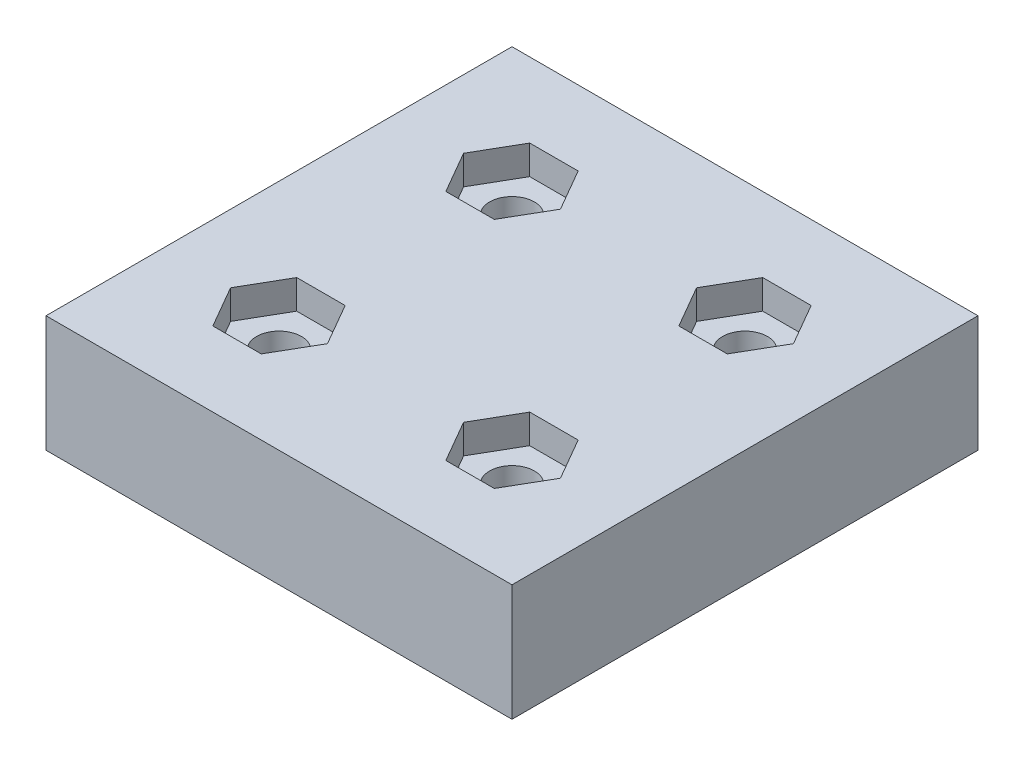
ISO-10303-21;
HEADER;
FILE_DESCRIPTION(('STEP AP214'),'2;1');
FILE_NAME('part.step','',(''),(''),'','','');
FILE_SCHEMA(('AUTOMOTIVE_DESIGN { 1 0 10303 214 1 1 1 1 }'));
ENDSEC;
DATA;
#1=APPLICATION_CONTEXT('core data for automotive mechanical design processes');
#2=APPLICATION_PROTOCOL_DEFINITION('international standard','automotive_design',2000,#1);
#3=PRODUCT_CONTEXT('',#1,'mechanical');
#4=PRODUCT('Part','Part','',(#3));
#5=PRODUCT_RELATED_PRODUCT_CATEGORY('part','',(#4));
#6=PRODUCT_DEFINITION_FORMATION('','',#4);
#7=PRODUCT_DEFINITION_CONTEXT('part definition',#1,'design');
#8=PRODUCT_DEFINITION('design','',#6,#7);
#9=PRODUCT_DEFINITION_SHAPE('','',#8);
#10=(LENGTH_UNIT() NAMED_UNIT(*) SI_UNIT(.MILLI.,.METRE.));
#11=(NAMED_UNIT(*) PLANE_ANGLE_UNIT() SI_UNIT($,.RADIAN.));
#12=(NAMED_UNIT(*) SI_UNIT($,.STERADIAN.) SOLID_ANGLE_UNIT());
#13=UNCERTAINTY_MEASURE_WITH_UNIT(LENGTH_MEASURE(1.E-05),#10,'distance_accuracy_value','');
#14=(GEOMETRIC_REPRESENTATION_CONTEXT(3) GLOBAL_UNCERTAINTY_ASSIGNED_CONTEXT((#13)) GLOBAL_UNIT_ASSIGNED_CONTEXT((#10,
#11,#12)) REPRESENTATION_CONTEXT('',''));
#15=CARTESIAN_POINT('',(0.,0.,0.));
#16=DIRECTION('',(0.,0.,1.));
#17=DIRECTION('',(1.,0.,0.));
#18=AXIS2_PLACEMENT_3D('',#15,#16,#17);
#19=CARTESIAN_POINT('',(10.,10.,-30.));
#20=DIRECTION('',(0.,-1.,0.));
#21=DIRECTION('',(0.,0.,-1.));
#22=AXIS2_PLACEMENT_3D('',#19,#20,#21);
#23=CYLINDRICAL_SURFACE('',#22,1.925);
#24=CARTESIAN_POINT('',(10.,0.,-30.));
#25=DIRECTION('',(0.,1.,0.));
#26=DIRECTION('',(0.,0.,1.));
#27=AXIS2_PLACEMENT_3D('',#24,#25,#26);
#28=CIRCLE('',#27,1.925);
#29=CARTESIAN_POINT('',(10.,0.,-28.075));
#30=VERTEX_POINT('',#29);
#31=EDGE_CURVE('E428',#30,#30,#28,.T.);
#32=ORIENTED_EDGE('',*,*,#31,.F.);
#33=EDGE_LOOP('',(#32));
#34=FACE_BOUND('',#33,.T.);
#35=CARTESIAN_POINT('',(10.,7.5,-30.));
#36=DIRECTION('',(0.,1.,0.));
#37=DIRECTION('',(0.,0.,1.));
#38=AXIS2_PLACEMENT_3D('',#35,#36,#37);
#39=CIRCLE('',#38,1.925);
#40=CARTESIAN_POINT('',(10.,7.5,-28.075));
#41=VERTEX_POINT('',#40);
#42=EDGE_CURVE('E37',#41,#41,#39,.T.);
#43=ORIENTED_EDGE('',*,*,#42,.T.);
#44=EDGE_LOOP('',(#43));
#45=FACE_BOUND('',#44,.T.);
#46=ADVANCED_FACE('F33',(#34,#45),#23,.F.);
#47=CARTESIAN_POINT('',(30.,10.,-30.));
#48=DIRECTION('',(0.,-1.,0.));
#49=DIRECTION('',(0.,0.,-1.));
#50=AXIS2_PLACEMENT_3D('',#47,#48,#49);
#51=CYLINDRICAL_SURFACE('',#50,1.925);
#52=CARTESIAN_POINT('',(30.,0.,-30.));
#53=DIRECTION('',(0.,1.,0.));
#54=DIRECTION('',(0.,0.,1.));
#55=AXIS2_PLACEMENT_3D('',#52,#53,#54);
#56=CIRCLE('',#55,1.925);
#57=CARTESIAN_POINT('',(30.,0.,-28.075));
#58=VERTEX_POINT('',#57);
#59=EDGE_CURVE('E425',#58,#58,#56,.T.);
#60=ORIENTED_EDGE('',*,*,#59,.F.);
#61=EDGE_LOOP('',(#60));
#62=FACE_BOUND('',#61,.T.);
#63=CARTESIAN_POINT('',(30.,7.5,-30.));
#64=DIRECTION('',(0.,1.,0.));
#65=DIRECTION('',(0.,0.,1.));
#66=AXIS2_PLACEMENT_3D('',#63,#64,#65);
#67=CIRCLE('',#66,1.925);
#68=CARTESIAN_POINT('',(30.,7.5,-28.075));
#69=VERTEX_POINT('',#68);
#70=EDGE_CURVE('E461',#69,#69,#67,.T.);
#71=ORIENTED_EDGE('',*,*,#70,.T.);
#72=EDGE_LOOP('',(#71));
#73=FACE_BOUND('',#72,.T.);
#74=ADVANCED_FACE('F577',(#62,#73),#51,.F.);
#75=CARTESIAN_POINT('',(30.,10.,-10.));
#76=DIRECTION('',(0.,-1.,0.));
#77=DIRECTION('',(0.,0.,-1.));
#78=AXIS2_PLACEMENT_3D('',#75,#76,#77);
#79=CYLINDRICAL_SURFACE('',#78,1.925);
#80=CARTESIAN_POINT('',(30.,0.,-10.));
#81=DIRECTION('',(0.,1.,0.));
#82=DIRECTION('',(0.,0.,1.));
#83=AXIS2_PLACEMENT_3D('',#80,#81,#82);
#84=CIRCLE('',#83,1.925);
#85=CARTESIAN_POINT('',(30.,0.,-8.075));
#86=VERTEX_POINT('',#85);
#87=EDGE_CURVE('E422',#86,#86,#84,.T.);
#88=ORIENTED_EDGE('',*,*,#87,.F.);
#89=EDGE_LOOP('',(#88));
#90=FACE_BOUND('',#89,.T.);
#91=CARTESIAN_POINT('',(30.,7.5,-10.));
#92=DIRECTION('',(0.,1.,0.));
#93=DIRECTION('',(0.,0.,1.));
#94=AXIS2_PLACEMENT_3D('',#91,#92,#93);
#95=CIRCLE('',#94,1.925);
#96=CARTESIAN_POINT('',(30.,7.5,-8.075));
#97=VERTEX_POINT('',#96);
#98=EDGE_CURVE('E459',#97,#97,#95,.T.);
#99=ORIENTED_EDGE('',*,*,#98,.T.);
#100=EDGE_LOOP('',(#99));
#101=FACE_BOUND('',#100,.T.);
#102=ADVANCED_FACE('F539',(#90,#101),#79,.F.);
#103=CARTESIAN_POINT('',(10.,10.,-10.));
#104=DIRECTION('',(0.,-1.,0.));
#105=DIRECTION('',(0.,0.,-1.));
#106=AXIS2_PLACEMENT_3D('',#103,#104,#105);
#107=CYLINDRICAL_SURFACE('',#106,1.925);
#108=CARTESIAN_POINT('',(10.,0.,-10.));
#109=DIRECTION('',(0.,1.,0.));
#110=DIRECTION('',(0.,0.,1.));
#111=AXIS2_PLACEMENT_3D('',#108,#109,#110);
#112=CIRCLE('',#111,1.925);
#113=CARTESIAN_POINT('',(10.,0.,-8.075));
#114=VERTEX_POINT('',#113);
#115=EDGE_CURVE('E419',#114,#114,#112,.T.);
#116=ORIENTED_EDGE('',*,*,#115,.F.);
#117=EDGE_LOOP('',(#116));
#118=FACE_BOUND('',#117,.T.);
#119=CARTESIAN_POINT('',(10.,7.5,-10.));
#120=DIRECTION('',(0.,1.,0.));
#121=DIRECTION('',(0.,0.,1.));
#122=AXIS2_PLACEMENT_3D('',#119,#120,#121);
#123=CIRCLE('',#122,1.925);
#124=CARTESIAN_POINT('',(10.,7.5,-8.075));
#125=VERTEX_POINT('',#124);
#126=EDGE_CURVE('E408',#125,#125,#123,.T.);
#127=ORIENTED_EDGE('',*,*,#126,.T.);
#128=EDGE_LOOP('',(#127));
#129=FACE_BOUND('',#128,.T.);
#130=ADVANCED_FACE('F500',(#118,#129),#107,.F.);
#131=CARTESIAN_POINT('',(0.,10.,0.));
#132=DIRECTION('',(0.,-1.,0.));
#133=DIRECTION('',(0.,0.,-1.));
#134=AXIS2_PLACEMENT_3D('',#131,#132,#133);
#135=PLANE('',#134);
#136=DIRECTION('',(-0.5,0.,-0.866025403784439));
#137=VECTOR('',#136,1.);
#138=CARTESIAN_POINT('',(14.1569219381653,10.,-30.));
#139=LINE('',#138,#137);
#140=CARTESIAN_POINT('',(14.1569219381653,10.,-30.));
#141=VERTEX_POINT('',#140);
#142=CARTESIAN_POINT('',(12.0784609690827,10.,-33.6));
#143=VERTEX_POINT('',#142);
#144=EDGE_CURVE('E347',#141,#143,#139,.T.);
#145=ORIENTED_EDGE('',*,*,#144,.F.);
#146=DIRECTION('',(0.5,0.,-0.866025403784439));
#147=VECTOR('',#146,1.);
#148=CARTESIAN_POINT('',(12.0784609690827,10.,-26.4));
#149=LINE('',#148,#147);
#150=CARTESIAN_POINT('',(12.0784609690827,10.,-26.4));
#151=VERTEX_POINT('',#150);
#152=EDGE_CURVE('E50',#151,#141,#149,.T.);
#153=ORIENTED_EDGE('',*,*,#152,.F.);
#154=DIRECTION('',(1.,0.,0.));
#155=VECTOR('',#154,1.);
#156=CARTESIAN_POINT('',(7.92153903091735,10.,-26.4));
#157=LINE('',#156,#155);
#158=CARTESIAN_POINT('',(7.92153903091735,10.,-26.4));
#159=VERTEX_POINT('',#158);
#160=EDGE_CURVE('E330',#159,#151,#157,.T.);
#161=ORIENTED_EDGE('',*,*,#160,.F.);
#162=DIRECTION('',(0.5,0.,0.866025403784439));
#163=VECTOR('',#162,1.);
#164=CARTESIAN_POINT('',(5.8430780618347,10.,-30.));
#165=LINE('',#164,#163);
#166=CARTESIAN_POINT('',(5.8430780618347,10.,-30.));
#167=VERTEX_POINT('',#166);
#168=EDGE_CURVE('E356',#167,#159,#165,.T.);
#169=ORIENTED_EDGE('',*,*,#168,.F.);
#170=DIRECTION('',(-0.5,0.,0.866025403784439));
#171=VECTOR('',#170,1.);
#172=CARTESIAN_POINT('',(7.92153903091735,10.,-33.6));
#173=LINE('',#172,#171);
#174=CARTESIAN_POINT('',(7.92153903091735,10.,-33.6));
#175=VERTEX_POINT('',#174);
#176=EDGE_CURVE('E353',#175,#167,#173,.T.);
#177=ORIENTED_EDGE('',*,*,#176,.F.);
#178=DIRECTION('',(-1.,0.,0.));
#179=VECTOR('',#178,1.);
#180=CARTESIAN_POINT('',(12.0784609690827,10.,-33.6));
#181=LINE('',#180,#179);
#182=EDGE_CURVE('E350',#143,#175,#181,.T.);
#183=ORIENTED_EDGE('',*,*,#182,.F.);
#184=EDGE_LOOP('',(#145,#153,#161,#169,#177,#183));
#185=FACE_BOUND('',#184,.T.);
#186=DIRECTION('',(0.5,0.,0.866025403784439));
#187=VECTOR('',#186,1.);
#188=CARTESIAN_POINT('',(25.8430780618347,10.,-30.));
#189=LINE('',#188,#187);
#190=CARTESIAN_POINT('',(25.8430780618347,10.,-30.));
#191=VERTEX_POINT('',#190);
#192=CARTESIAN_POINT('',(27.9215390309173,10.,-26.4));
#193=VERTEX_POINT('',#192);
#194=EDGE_CURVE('E301',#191,#193,#189,.T.);
#195=ORIENTED_EDGE('',*,*,#194,.F.);
#196=DIRECTION('',(-0.5,0.,0.866025403784439));
#197=VECTOR('',#196,1.);
#198=CARTESIAN_POINT('',(27.9215390309173,10.,-33.6));
#199=LINE('',#198,#197);
#200=CARTESIAN_POINT('',(27.9215390309173,10.,-33.6));
#201=VERTEX_POINT('',#200);
#202=EDGE_CURVE('E58',#201,#191,#199,.T.);
#203=ORIENTED_EDGE('',*,*,#202,.F.);
#204=DIRECTION('',(-1.,0.,0.));
#205=VECTOR('',#204,1.);
#206=CARTESIAN_POINT('',(32.0784609690826,10.,-33.6));
#207=LINE('',#206,#205);
#208=CARTESIAN_POINT('',(32.0784609690826,10.,-33.6));
#209=VERTEX_POINT('',#208);
#210=EDGE_CURVE('E284',#209,#201,#207,.T.);
#211=ORIENTED_EDGE('',*,*,#210,.F.);
#212=DIRECTION('',(-0.5,0.,-0.866025403784439));
#213=VECTOR('',#212,1.);
#214=CARTESIAN_POINT('',(34.1569219381653,10.,-30.));
#215=LINE('',#214,#213);
#216=CARTESIAN_POINT('',(34.1569219381653,10.,-30.));
#217=VERTEX_POINT('',#216);
#218=EDGE_CURVE('E311',#217,#209,#215,.T.);
#219=ORIENTED_EDGE('',*,*,#218,.F.);
#220=DIRECTION('',(0.499999999999999,0.,-0.866025403784439));
#221=VECTOR('',#220,1.);
#222=CARTESIAN_POINT('',(32.0784609690827,10.,-26.4));
#223=LINE('',#222,#221);
#224=CARTESIAN_POINT('',(32.0784609690827,10.,-26.4));
#225=VERTEX_POINT('',#224);
#226=EDGE_CURVE('E308',#225,#217,#223,.T.);
#227=ORIENTED_EDGE('',*,*,#226,.F.);
#228=DIRECTION('',(1.,0.,0.));
#229=VECTOR('',#228,1.);
#230=CARTESIAN_POINT('',(27.9215390309173,10.,-26.4));
#231=LINE('',#230,#229);
#232=EDGE_CURVE('E305',#193,#225,#231,.T.);
#233=ORIENTED_EDGE('',*,*,#232,.F.);
#234=EDGE_LOOP('',(#195,#203,#211,#219,#227,#233));
#235=FACE_BOUND('',#234,.T.);
#236=DIRECTION('',(0.5,0.,0.866025403784439));
#237=VECTOR('',#236,1.);
#238=CARTESIAN_POINT('',(25.8430780618347,10.,-10.));
#239=LINE('',#238,#237);
#240=CARTESIAN_POINT('',(25.8430780618347,10.,-10.));
#241=VERTEX_POINT('',#240);
#242=CARTESIAN_POINT('',(27.9215390309173,10.,-6.4));
#243=VERTEX_POINT('',#242);
#244=EDGE_CURVE('E259',#241,#243,#239,.T.);
#245=ORIENTED_EDGE('',*,*,#244,.F.);
#246=DIRECTION('',(-0.5,0.,0.866025403784439));
#247=VECTOR('',#246,1.);
#248=CARTESIAN_POINT('',(27.9215390309173,10.,-13.6));
#249=LINE('',#248,#247);
#250=CARTESIAN_POINT('',(27.9215390309173,10.,-13.6));
#251=VERTEX_POINT('',#250);
#252=EDGE_CURVE('E227',#251,#241,#249,.T.);
#253=ORIENTED_EDGE('',*,*,#252,.F.);
#254=DIRECTION('',(-1.,0.,0.));
#255=VECTOR('',#254,1.);
#256=CARTESIAN_POINT('',(32.0784609690827,10.,-13.6));
#257=LINE('',#256,#255);
#258=CARTESIAN_POINT('',(32.0784609690827,10.,-13.6));
#259=VERTEX_POINT('',#258);
#260=EDGE_CURVE('E245',#259,#251,#257,.T.);
#261=ORIENTED_EDGE('',*,*,#260,.F.);
#262=DIRECTION('',(-0.5,0.,-0.866025403784439));
#263=VECTOR('',#262,1.);
#264=CARTESIAN_POINT('',(34.1569219381653,10.,-10.));
#265=LINE('',#264,#263);
#266=CARTESIAN_POINT('',(34.1569219381653,10.,-10.));
#267=VERTEX_POINT('',#266);
#268=EDGE_CURVE('E248',#267,#259,#265,.T.);
#269=ORIENTED_EDGE('',*,*,#268,.F.);
#270=DIRECTION('',(0.5,0.,-0.866025403784439));
#271=VECTOR('',#270,1.);
#272=CARTESIAN_POINT('',(32.0784609690827,10.,-6.4));
#273=LINE('',#272,#271);
#274=CARTESIAN_POINT('',(32.0784609690827,10.,-6.4));
#275=VERTEX_POINT('',#274);
#276=EDGE_CURVE('E265',#275,#267,#273,.T.);
#277=ORIENTED_EDGE('',*,*,#276,.F.);
#278=DIRECTION('',(1.,0.,0.));
#279=VECTOR('',#278,1.);
#280=CARTESIAN_POINT('',(27.9215390309173,10.,-6.4));
#281=LINE('',#280,#279);
#282=EDGE_CURVE('E262',#243,#275,#281,.T.);
#283=ORIENTED_EDGE('',*,*,#282,.F.);
#284=EDGE_LOOP('',(#245,#253,#261,#269,#277,#283));
#285=FACE_BOUND('',#284,.T.);
#286=DIRECTION('',(-0.5,0.,-0.866025403784439));
#287=VECTOR('',#286,1.);
#288=CARTESIAN_POINT('',(14.1569219381653,10.,-10.));
#289=LINE('',#288,#287);
#290=CARTESIAN_POINT('',(14.1569219381653,10.,-10.));
#291=VERTEX_POINT('',#290);
#292=CARTESIAN_POINT('',(12.0784609690827,10.,-13.6));
#293=VERTEX_POINT('',#292);
#294=EDGE_CURVE('E392',#291,#293,#289,.T.);
#295=ORIENTED_EDGE('',*,*,#294,.F.);
#296=DIRECTION('',(0.499999999999999,0.,-0.866025403784439));
#297=VECTOR('',#296,1.);
#298=CARTESIAN_POINT('',(12.0784609690827,10.,-6.4));
#299=LINE('',#298,#297);
#300=CARTESIAN_POINT('',(12.0784609690827,10.,-6.4));
#301=VERTEX_POINT('',#300);
#302=EDGE_CURVE('E272',#301,#291,#299,.T.);
#303=ORIENTED_EDGE('',*,*,#302,.F.);
#304=DIRECTION('',(1.,0.,0.));
#305=VECTOR('',#304,1.);
#306=CARTESIAN_POINT('',(7.92153903091735,10.,-6.4));
#307=LINE('',#306,#305);
#308=CARTESIAN_POINT('',(7.92153903091735,10.,-6.4));
#309=VERTEX_POINT('',#308);
#310=EDGE_CURVE('E375',#309,#301,#307,.T.);
#311=ORIENTED_EDGE('',*,*,#310,.F.);
#312=DIRECTION('',(0.5,0.,0.866025403784439));
#313=VECTOR('',#312,1.);
#314=CARTESIAN_POINT('',(5.84307806183469,10.,-10.));
#315=LINE('',#314,#313);
#316=CARTESIAN_POINT('',(5.84307806183469,10.,-10.));
#317=VERTEX_POINT('',#316);
#318=EDGE_CURVE('E401',#317,#309,#315,.T.);
#319=ORIENTED_EDGE('',*,*,#318,.F.);
#320=DIRECTION('',(-0.5,0.,0.866025403784439));
#321=VECTOR('',#320,1.);
#322=CARTESIAN_POINT('',(7.92153903091735,10.,-13.6));
#323=LINE('',#322,#321);
#324=CARTESIAN_POINT('',(7.92153903091735,10.,-13.6));
#325=VERTEX_POINT('',#324);
#326=EDGE_CURVE('E398',#325,#317,#323,.T.);
#327=ORIENTED_EDGE('',*,*,#326,.F.);
#328=DIRECTION('',(-1.,0.,0.));
#329=VECTOR('',#328,1.);
#330=CARTESIAN_POINT('',(12.0784609690827,10.,-13.6));
#331=LINE('',#330,#329);
#332=EDGE_CURVE('E395',#293,#325,#331,.T.);
#333=ORIENTED_EDGE('',*,*,#332,.F.);
#334=EDGE_LOOP('',(#295,#303,#311,#319,#327,#333));
#335=FACE_BOUND('',#334,.T.);
#336=DIRECTION('',(0.,0.,1.));
#337=VECTOR('',#336,1.);
#338=CARTESIAN_POINT('',(0.,10.,0.));
#339=LINE('',#338,#337);
#340=CARTESIAN_POINT('',(0.,10.,-40.));
#341=VERTEX_POINT('',#340);
#342=CARTESIAN_POINT('',(0.,10.,0.));
#343=VERTEX_POINT('',#342);
#344=EDGE_CURVE('E432',#341,#343,#339,.T.);
#345=ORIENTED_EDGE('',*,*,#344,.T.);
#346=DIRECTION('',(1.,0.,0.));
#347=VECTOR('',#346,1.);
#348=CARTESIAN_POINT('',(0.,10.,0.));
#349=LINE('',#348,#347);
#350=CARTESIAN_POINT('',(40.,10.,0.));
#351=VERTEX_POINT('',#350);
#352=EDGE_CURVE('E435',#343,#351,#349,.T.);
#353=ORIENTED_EDGE('',*,*,#352,.T.);
#354=DIRECTION('',(0.,0.,-1.));
#355=VECTOR('',#354,1.);
#356=CARTESIAN_POINT('',(40.,10.,0.));
#357=LINE('',#356,#355);
#358=CARTESIAN_POINT('',(40.,10.,-40.));
#359=VERTEX_POINT('',#358);
#360=EDGE_CURVE('E438',#351,#359,#357,.T.);
#361=ORIENTED_EDGE('',*,*,#360,.T.);
#362=DIRECTION('',(-1.,0.,0.));
#363=VECTOR('',#362,1.);
#364=CARTESIAN_POINT('',(0.,10.,-40.));
#365=LINE('',#364,#363);
#366=EDGE_CURVE('E440',#359,#341,#365,.T.);
#367=ORIENTED_EDGE('',*,*,#366,.T.);
#368=EDGE_LOOP('',(#345,#353,#361,#367));
#369=FACE_BOUND('',#368,.T.);
#370=ADVANCED_FACE('F496',(#185,#235,#285,#335,#369),#135,.F.);
#371=CARTESIAN_POINT('',(0.,0.,0.));
#372=DIRECTION('',(0.,-1.,0.));
#373=DIRECTION('',(0.,0.,-1.));
#374=AXIS2_PLACEMENT_3D('',#371,#372,#373);
#375=PLANE('',#374);
#376=ORIENTED_EDGE('',*,*,#87,.T.);
#377=EDGE_LOOP('',(#376));
#378=FACE_BOUND('',#377,.T.);
#379=ORIENTED_EDGE('',*,*,#31,.T.);
#380=EDGE_LOOP('',(#379));
#381=FACE_BOUND('',#380,.T.);
#382=DIRECTION('',(0.,0.,1.));
#383=VECTOR('',#382,1.);
#384=CARTESIAN_POINT('',(0.,0.,0.));
#385=LINE('',#384,#383);
#386=CARTESIAN_POINT('',(0.,0.,-40.));
#387=VERTEX_POINT('',#386);
#388=CARTESIAN_POINT('',(0.,0.,0.));
#389=VERTEX_POINT('',#388);
#390=EDGE_CURVE('E431',#387,#389,#385,.T.);
#391=ORIENTED_EDGE('',*,*,#390,.F.);
#392=DIRECTION('',(-1.,0.,0.));
#393=VECTOR('',#392,1.);
#394=CARTESIAN_POINT('',(0.,0.,-40.));
#395=LINE('',#394,#393);
#396=CARTESIAN_POINT('',(40.,0.,-40.));
#397=VERTEX_POINT('',#396);
#398=EDGE_CURVE('E436',#397,#387,#395,.T.);
#399=ORIENTED_EDGE('',*,*,#398,.F.);
#400=DIRECTION('',(0.,0.,-1.));
#401=VECTOR('',#400,1.);
#402=CARTESIAN_POINT('',(40.,0.,0.));
#403=LINE('',#402,#401);
#404=CARTESIAN_POINT('',(40.,0.,0.));
#405=VERTEX_POINT('',#404);
#406=EDGE_CURVE('E447',#405,#397,#403,.T.);
#407=ORIENTED_EDGE('',*,*,#406,.F.);
#408=DIRECTION('',(1.,0.,0.));
#409=VECTOR('',#408,1.);
#410=CARTESIAN_POINT('',(0.,0.,0.));
#411=LINE('',#410,#409);
#412=EDGE_CURVE('E445',#389,#405,#411,.T.);
#413=ORIENTED_EDGE('',*,*,#412,.F.);
#414=EDGE_LOOP('',(#391,#399,#407,#413));
#415=FACE_BOUND('',#414,.T.);
#416=ORIENTED_EDGE('',*,*,#59,.T.);
#417=EDGE_LOOP('',(#416));
#418=FACE_BOUND('',#417,.T.);
#419=ORIENTED_EDGE('',*,*,#115,.T.);
#420=EDGE_LOOP('',(#419));
#421=FACE_BOUND('',#420,.T.);
#422=ADVANCED_FACE('F499',(#378,#381,#415,#418,#421),#375,.T.);
#423=CARTESIAN_POINT('',(0.,10.,0.));
#424=DIRECTION('',(1.,0.,0.));
#425=DIRECTION('',(0.,0.,-1.));
#426=AXIS2_PLACEMENT_3D('',#423,#424,#425);
#427=PLANE('',#426);
#428=ORIENTED_EDGE('',*,*,#390,.T.);
#429=DIRECTION('',(0.,-1.,0.));
#430=VECTOR('',#429,1.);
#431=CARTESIAN_POINT('',(0.,10.,0.));
#432=LINE('',#431,#430);
#433=EDGE_CURVE('E11',#343,#389,#432,.T.);
#434=ORIENTED_EDGE('',*,*,#433,.F.);
#435=ORIENTED_EDGE('',*,*,#344,.F.);
#436=DIRECTION('',(0.,-1.,0.));
#437=VECTOR('',#436,1.);
#438=CARTESIAN_POINT('',(0.,10.,-40.));
#439=LINE('',#438,#437);
#440=EDGE_CURVE('E442',#341,#387,#439,.T.);
#441=ORIENTED_EDGE('',*,*,#440,.T.);
#442=EDGE_LOOP('',(#428,#434,#435,#441));
#443=FACE_BOUND('',#442,.T.);
#444=ADVANCED_FACE('F35',(#443),#427,.F.);
#445=CARTESIAN_POINT('',(0.,10.,0.));
#446=DIRECTION('',(0.,0.,-1.));
#447=DIRECTION('',(-1.,0.,0.));
#448=AXIS2_PLACEMENT_3D('',#445,#446,#447);
#449=PLANE('',#448);
#450=ORIENTED_EDGE('',*,*,#412,.T.);
#451=DIRECTION('',(0.,-1.,0.));
#452=VECTOR('',#451,1.);
#453=CARTESIAN_POINT('',(40.,10.,0.));
#454=LINE('',#453,#452);
#455=EDGE_CURVE('E42',#351,#405,#454,.T.);
#456=ORIENTED_EDGE('',*,*,#455,.F.);
#457=ORIENTED_EDGE('',*,*,#352,.F.);
#458=ORIENTED_EDGE('',*,*,#433,.T.);
#459=EDGE_LOOP('',(#450,#456,#457,#458));
#460=FACE_BOUND('',#459,.T.);
#461=ADVANCED_FACE('F519',(#460),#449,.F.);
#462=CARTESIAN_POINT('',(40.,10.,0.));
#463=DIRECTION('',(-1.,0.,0.));
#464=DIRECTION('',(0.,0.,1.));
#465=AXIS2_PLACEMENT_3D('',#462,#463,#464);
#466=PLANE('',#465);
#467=ORIENTED_EDGE('',*,*,#406,.T.);
#468=DIRECTION('',(0.,-1.,0.));
#469=VECTOR('',#468,1.);
#470=CARTESIAN_POINT('',(40.,10.,-40.));
#471=LINE('',#470,#469);
#472=EDGE_CURVE('E452',#359,#397,#471,.T.);
#473=ORIENTED_EDGE('',*,*,#472,.F.);
#474=ORIENTED_EDGE('',*,*,#360,.F.);
#475=ORIENTED_EDGE('',*,*,#455,.T.);
#476=EDGE_LOOP('',(#467,#473,#474,#475));
#477=FACE_BOUND('',#476,.T.);
#478=ADVANCED_FACE('F524',(#477),#466,.F.);
#479=CARTESIAN_POINT('',(0.,10.,-40.));
#480=DIRECTION('',(0.,0.,1.));
#481=DIRECTION('',(1.,0.,0.));
#482=AXIS2_PLACEMENT_3D('',#479,#480,#481);
#483=PLANE('',#482);
#484=ORIENTED_EDGE('',*,*,#398,.T.);
#485=ORIENTED_EDGE('',*,*,#440,.F.);
#486=ORIENTED_EDGE('',*,*,#366,.F.);
#487=ORIENTED_EDGE('',*,*,#472,.T.);
#488=EDGE_LOOP('',(#484,#485,#486,#487));
#489=FACE_BOUND('',#488,.T.);
#490=ADVANCED_FACE('F527',(#489),#483,.F.);
#491=CARTESIAN_POINT('',(12.0784609690827,7.5,-6.4));
#492=DIRECTION('',(0.866025403784439,0.,0.499999999999999));
#493=DIRECTION('',(0.499999999999999,0.,-0.866025403784439));
#494=AXIS2_PLACEMENT_3D('',#491,#492,#493);
#495=PLANE('',#494);
#496=ORIENTED_EDGE('',*,*,#302,.T.);
#497=DIRECTION('',(0.,1.,0.));
#498=VECTOR('',#497,1.);
#499=CARTESIAN_POINT('',(14.1569219381653,7.5,-10.));
#500=LINE('',#499,#498);
#501=CARTESIAN_POINT('',(14.1569219381653,7.5,-10.));
#502=VERTEX_POINT('',#501);
#503=EDGE_CURVE('E390',#502,#291,#500,.T.);
#504=ORIENTED_EDGE('',*,*,#503,.F.);
#505=DIRECTION('',(0.499999999999999,0.,-0.866025403784439));
#506=VECTOR('',#505,1.);
#507=CARTESIAN_POINT('',(12.0784609690827,7.5,-6.4));
#508=LINE('',#507,#506);
#509=CARTESIAN_POINT('',(12.0784609690827,7.5,-6.4));
#510=VERTEX_POINT('',#509);
#511=EDGE_CURVE('E371',#510,#502,#508,.T.);
#512=ORIENTED_EDGE('',*,*,#511,.F.);
#513=DIRECTION('',(0.,1.,0.));
#514=VECTOR('',#513,1.);
#515=CARTESIAN_POINT('',(12.0784609690827,7.5,-6.4));
#516=LINE('',#515,#514);
#517=EDGE_CURVE('E406',#510,#301,#516,.T.);
#518=ORIENTED_EDGE('',*,*,#517,.T.);
#519=EDGE_LOOP('',(#496,#504,#512,#518));
#520=FACE_BOUND('',#519,.T.);
#521=ADVANCED_FACE('F552',(#520),#495,.F.);
#522=CARTESIAN_POINT('',(7.92153903091735,7.5,-6.4));
#523=DIRECTION('',(0.,0.,1.));
#524=DIRECTION('',(1.,0.,0.));
#525=AXIS2_PLACEMENT_3D('',#522,#523,#524);
#526=PLANE('',#525);
#527=ORIENTED_EDGE('',*,*,#310,.T.);
#528=ORIENTED_EDGE('',*,*,#517,.F.);
#529=DIRECTION('',(1.,0.,0.));
#530=VECTOR('',#529,1.);
#531=CARTESIAN_POINT('',(7.92153903091735,7.5,-6.4));
#532=LINE('',#531,#530);
#533=CARTESIAN_POINT('',(7.92153903091735,7.5,-6.4));
#534=VERTEX_POINT('',#533);
#535=EDGE_CURVE('E387',#534,#510,#532,.T.);
#536=ORIENTED_EDGE('',*,*,#535,.F.);
#537=DIRECTION('',(0.,1.,0.));
#538=VECTOR('',#537,1.);
#539=CARTESIAN_POINT('',(7.92153903091735,7.5,-6.4));
#540=LINE('',#539,#538);
#541=EDGE_CURVE('E409',#534,#309,#540,.T.);
#542=ORIENTED_EDGE('',*,*,#541,.T.);
#543=EDGE_LOOP('',(#527,#528,#536,#542));
#544=FACE_BOUND('',#543,.T.);
#545=ADVANCED_FACE('F567',(#544),#526,.F.);
#546=CARTESIAN_POINT('',(5.84307806183469,7.5,-10.));
#547=DIRECTION('',(-0.866025403784439,0.,0.5));
#548=DIRECTION('',(0.5,0.,0.866025403784439));
#549=AXIS2_PLACEMENT_3D('',#546,#547,#548);
#550=PLANE('',#549);
#551=ORIENTED_EDGE('',*,*,#318,.T.);
#552=ORIENTED_EDGE('',*,*,#541,.F.);
#553=DIRECTION('',(0.5,0.,0.866025403784439));
#554=VECTOR('',#553,1.);
#555=CARTESIAN_POINT('',(5.84307806183469,7.5,-10.));
#556=LINE('',#555,#554);
#557=CARTESIAN_POINT('',(5.84307806183469,7.5,-10.));
#558=VERTEX_POINT('',#557);
#559=EDGE_CURVE('E384',#558,#534,#556,.T.);
#560=ORIENTED_EDGE('',*,*,#559,.F.);
#561=DIRECTION('',(0.,1.,0.));
#562=VECTOR('',#561,1.);
#563=CARTESIAN_POINT('',(5.84307806183469,7.5,-10.));
#564=LINE('',#563,#562);
#565=EDGE_CURVE('E411',#558,#317,#564,.T.);
#566=ORIENTED_EDGE('',*,*,#565,.T.);
#567=EDGE_LOOP('',(#551,#552,#560,#566));
#568=FACE_BOUND('',#567,.T.);
#569=ADVANCED_FACE('F564',(#568),#550,.F.);
#570=CARTESIAN_POINT('',(7.92153903091735,7.5,-13.6));
#571=DIRECTION('',(-0.866025403784439,0.,-0.5));
#572=DIRECTION('',(-0.5,0.,0.866025403784439));
#573=AXIS2_PLACEMENT_3D('',#570,#571,#572);
#574=PLANE('',#573);
#575=ORIENTED_EDGE('',*,*,#326,.T.);
#576=ORIENTED_EDGE('',*,*,#565,.F.);
#577=DIRECTION('',(-0.5,0.,0.866025403784439));
#578=VECTOR('',#577,1.);
#579=CARTESIAN_POINT('',(7.92153903091735,7.5,-13.6));
#580=LINE('',#579,#578);
#581=CARTESIAN_POINT('',(7.92153903091735,7.5,-13.6));
#582=VERTEX_POINT('',#581);
#583=EDGE_CURVE('E381',#582,#558,#580,.T.);
#584=ORIENTED_EDGE('',*,*,#583,.F.);
#585=DIRECTION('',(0.,1.,0.));
#586=VECTOR('',#585,1.);
#587=CARTESIAN_POINT('',(7.92153903091735,7.5,-13.6));
#588=LINE('',#587,#586);
#589=EDGE_CURVE('E413',#582,#325,#588,.T.);
#590=ORIENTED_EDGE('',*,*,#589,.T.);
#591=EDGE_LOOP('',(#575,#576,#584,#590));
#592=FACE_BOUND('',#591,.T.);
#593=ADVANCED_FACE('F560',(#592),#574,.F.);
#594=CARTESIAN_POINT('',(12.0784609690827,7.5,-13.6));
#595=DIRECTION('',(0.,0.,-1.));
#596=DIRECTION('',(-1.,0.,0.));
#597=AXIS2_PLACEMENT_3D('',#594,#595,#596);
#598=PLANE('',#597);
#599=ORIENTED_EDGE('',*,*,#332,.T.);
#600=ORIENTED_EDGE('',*,*,#589,.F.);
#601=DIRECTION('',(-1.,0.,0.));
#602=VECTOR('',#601,1.);
#603=CARTESIAN_POINT('',(12.0784609690827,7.5,-13.6));
#604=LINE('',#603,#602);
#605=CARTESIAN_POINT('',(12.0784609690827,7.5,-13.6));
#606=VERTEX_POINT('',#605);
#607=EDGE_CURVE('E378',#606,#582,#604,.T.);
#608=ORIENTED_EDGE('',*,*,#607,.F.);
#609=DIRECTION('',(0.,1.,0.));
#610=VECTOR('',#609,1.);
#611=CARTESIAN_POINT('',(12.0784609690827,7.5,-13.6));
#612=LINE('',#611,#610);
#613=EDGE_CURVE('E415',#606,#293,#612,.T.);
#614=ORIENTED_EDGE('',*,*,#613,.T.);
#615=EDGE_LOOP('',(#599,#600,#608,#614));
#616=FACE_BOUND('',#615,.T.);
#617=ADVANCED_FACE('F556',(#616),#598,.F.);
#618=CARTESIAN_POINT('',(14.1569219381653,7.5,-10.));
#619=DIRECTION('',(0.866025403784439,0.,-0.5));
#620=DIRECTION('',(-0.5,0.,-0.866025403784439));
#621=AXIS2_PLACEMENT_3D('',#618,#619,#620);
#622=PLANE('',#621);
#623=ORIENTED_EDGE('',*,*,#294,.T.);
#624=ORIENTED_EDGE('',*,*,#613,.F.);
#625=DIRECTION('',(-0.5,0.,-0.866025403784439));
#626=VECTOR('',#625,1.);
#627=CARTESIAN_POINT('',(14.1569219381653,7.5,-10.));
#628=LINE('',#627,#626);
#629=EDGE_CURVE('E374',#502,#606,#628,.T.);
#630=ORIENTED_EDGE('',*,*,#629,.F.);
#631=ORIENTED_EDGE('',*,*,#503,.T.);
#632=EDGE_LOOP('',(#623,#624,#630,#631));
#633=FACE_BOUND('',#632,.T.);
#634=ADVANCED_FACE('F546',(#633),#622,.F.);
#635=CARTESIAN_POINT('',(0.,7.5,0.));
#636=DIRECTION('',(0.,1.,0.));
#637=DIRECTION('',(0.,0.,1.));
#638=AXIS2_PLACEMENT_3D('',#635,#636,#637);
#639=PLANE('',#638);
#640=ORIENTED_EDGE('',*,*,#126,.F.);
#641=EDGE_LOOP('',(#640));
#642=FACE_BOUND('',#641,.T.);
#643=ORIENTED_EDGE('',*,*,#511,.T.);
#644=ORIENTED_EDGE('',*,*,#629,.T.);
#645=ORIENTED_EDGE('',*,*,#607,.T.);
#646=ORIENTED_EDGE('',*,*,#583,.T.);
#647=ORIENTED_EDGE('',*,*,#559,.T.);
#648=ORIENTED_EDGE('',*,*,#535,.T.);
#649=EDGE_LOOP('',(#643,#644,#645,#646,#647,#648));
#650=FACE_BOUND('',#649,.T.);
#651=ADVANCED_FACE('F543',(#642,#650),#639,.T.);
#652=CARTESIAN_POINT('',(27.9215390309173,7.5,-13.6));
#653=DIRECTION('',(-0.866025403784439,0.,-0.5));
#654=DIRECTION('',(-0.5,0.,0.866025403784439));
#655=AXIS2_PLACEMENT_3D('',#652,#653,#654);
#656=PLANE('',#655);
#657=ORIENTED_EDGE('',*,*,#252,.T.);
#658=DIRECTION('',(0.,1.,0.));
#659=VECTOR('',#658,1.);
#660=CARTESIAN_POINT('',(25.8430780618347,7.5,-10.));
#661=LINE('',#660,#659);
#662=CARTESIAN_POINT('',(25.8430780618347,7.5,-10.));
#663=VERTEX_POINT('',#662);
#664=EDGE_CURVE('E220',#663,#241,#661,.T.);
#665=ORIENTED_EDGE('',*,*,#664,.F.);
#666=DIRECTION('',(-0.5,0.,0.866025403784439));
#667=VECTOR('',#666,1.);
#668=CARTESIAN_POINT('',(27.9215390309173,7.5,-13.6));
#669=LINE('',#668,#667);
#670=CARTESIAN_POINT('',(27.9215390309173,7.5,-13.6));
#671=VERTEX_POINT('',#670);
#672=EDGE_CURVE('E224',#671,#663,#669,.T.);
#673=ORIENTED_EDGE('',*,*,#672,.F.);
#674=DIRECTION('',(0.,1.,0.));
#675=VECTOR('',#674,1.);
#676=CARTESIAN_POINT('',(27.9215390309173,7.5,-13.6));
#677=LINE('',#676,#675);
#678=EDGE_CURVE('E270',#671,#251,#677,.T.);
#679=ORIENTED_EDGE('',*,*,#678,.T.);
#680=EDGE_LOOP('',(#657,#665,#673,#679));
#681=FACE_BOUND('',#680,.T.);
#682=ADVANCED_FACE('F222',(#681),#656,.F.);
#683=CARTESIAN_POINT('',(32.0784609690827,7.5,-13.6));
#684=DIRECTION('',(0.,0.,-1.));
#685=DIRECTION('',(-1.,0.,0.));
#686=AXIS2_PLACEMENT_3D('',#683,#684,#685);
#687=PLANE('',#686);
#688=ORIENTED_EDGE('',*,*,#260,.T.);
#689=ORIENTED_EDGE('',*,*,#678,.F.);
#690=DIRECTION('',(-1.,0.,0.));
#691=VECTOR('',#690,1.);
#692=CARTESIAN_POINT('',(32.0784609690827,7.5,-13.6));
#693=LINE('',#692,#691);
#694=CARTESIAN_POINT('',(32.0784609690827,7.5,-13.6));
#695=VERTEX_POINT('',#694);
#696=EDGE_CURVE('E232',#695,#671,#693,.T.);
#697=ORIENTED_EDGE('',*,*,#696,.F.);
#698=DIRECTION('',(0.,1.,0.));
#699=VECTOR('',#698,1.);
#700=CARTESIAN_POINT('',(32.0784609690827,7.5,-13.6));
#701=LINE('',#700,#699);
#702=EDGE_CURVE('E273',#695,#259,#701,.T.);
#703=ORIENTED_EDGE('',*,*,#702,.T.);
#704=EDGE_LOOP('',(#688,#689,#697,#703));
#705=FACE_BOUND('',#704,.T.);
#706=ADVANCED_FACE('F700',(#705),#687,.F.);
#707=CARTESIAN_POINT('',(34.1569219381653,7.5,-10.));
#708=DIRECTION('',(0.866025403784439,0.,-0.5));
#709=DIRECTION('',(-0.5,0.,-0.866025403784439));
#710=AXIS2_PLACEMENT_3D('',#707,#708,#709);
#711=PLANE('',#710);
#712=ORIENTED_EDGE('',*,*,#268,.T.);
#713=ORIENTED_EDGE('',*,*,#702,.F.);
#714=DIRECTION('',(-0.5,0.,-0.866025403784439));
#715=VECTOR('',#714,1.);
#716=CARTESIAN_POINT('',(34.1569219381653,7.5,-10.));
#717=LINE('',#716,#715);
#718=CARTESIAN_POINT('',(34.1569219381653,7.5,-10.));
#719=VERTEX_POINT('',#718);
#720=EDGE_CURVE('E255',#719,#695,#717,.T.);
#721=ORIENTED_EDGE('',*,*,#720,.F.);
#722=DIRECTION('',(0.,1.,0.));
#723=VECTOR('',#722,1.);
#724=CARTESIAN_POINT('',(34.1569219381653,7.5,-10.));
#725=LINE('',#724,#723);
#726=EDGE_CURVE('E275',#719,#267,#725,.T.);
#727=ORIENTED_EDGE('',*,*,#726,.T.);
#728=EDGE_LOOP('',(#712,#713,#721,#727));
#729=FACE_BOUND('',#728,.T.);
#730=ADVANCED_FACE('F709',(#729),#711,.F.);
#731=CARTESIAN_POINT('',(32.0784609690827,7.5,-6.4));
#732=DIRECTION('',(0.866025403784439,0.,0.5));
#733=DIRECTION('',(0.5,0.,-0.866025403784439));
#734=AXIS2_PLACEMENT_3D('',#731,#732,#733);
#735=PLANE('',#734);
#736=ORIENTED_EDGE('',*,*,#276,.T.);
#737=ORIENTED_EDGE('',*,*,#726,.F.);
#738=DIRECTION('',(0.5,0.,-0.866025403784439));
#739=VECTOR('',#738,1.);
#740=CARTESIAN_POINT('',(32.0784609690827,7.5,-6.4));
#741=LINE('',#740,#739);
#742=CARTESIAN_POINT('',(32.0784609690827,7.5,-6.4));
#743=VERTEX_POINT('',#742);
#744=EDGE_CURVE('E252',#743,#719,#741,.T.);
#745=ORIENTED_EDGE('',*,*,#744,.F.);
#746=DIRECTION('',(0.,1.,0.));
#747=VECTOR('',#746,1.);
#748=CARTESIAN_POINT('',(32.0784609690827,7.5,-6.4));
#749=LINE('',#748,#747);
#750=EDGE_CURVE('E277',#743,#275,#749,.T.);
#751=ORIENTED_EDGE('',*,*,#750,.T.);
#752=EDGE_LOOP('',(#736,#737,#745,#751));
#753=FACE_BOUND('',#752,.T.);
#754=ADVANCED_FACE('F719',(#753),#735,.F.);
#755=CARTESIAN_POINT('',(27.9215390309173,7.5,-6.4));
#756=DIRECTION('',(0.,0.,1.));
#757=DIRECTION('',(1.,0.,0.));
#758=AXIS2_PLACEMENT_3D('',#755,#756,#757);
#759=PLANE('',#758);
#760=ORIENTED_EDGE('',*,*,#282,.T.);
#761=ORIENTED_EDGE('',*,*,#750,.F.);
#762=DIRECTION('',(1.,0.,0.));
#763=VECTOR('',#762,1.);
#764=CARTESIAN_POINT('',(27.9215390309173,7.5,-6.4));
#765=LINE('',#764,#763);
#766=CARTESIAN_POINT('',(27.9215390309173,7.5,-6.4));
#767=VERTEX_POINT('',#766);
#768=EDGE_CURVE('E240',#767,#743,#765,.T.);
#769=ORIENTED_EDGE('',*,*,#768,.F.);
#770=DIRECTION('',(0.,1.,0.));
#771=VECTOR('',#770,1.);
#772=CARTESIAN_POINT('',(27.9215390309173,7.5,-6.4));
#773=LINE('',#772,#771);
#774=EDGE_CURVE('E231',#767,#243,#773,.T.);
#775=ORIENTED_EDGE('',*,*,#774,.T.);
#776=EDGE_LOOP('',(#760,#761,#769,#775));
#777=FACE_BOUND('',#776,.T.);
#778=ADVANCED_FACE('F729',(#777),#759,.F.);
#779=CARTESIAN_POINT('',(25.8430780618347,7.5,-10.));
#780=DIRECTION('',(-0.866025403784439,0.,0.5));
#781=DIRECTION('',(0.5,0.,0.866025403784439));
#782=AXIS2_PLACEMENT_3D('',#779,#780,#781);
#783=PLANE('',#782);
#784=ORIENTED_EDGE('',*,*,#244,.T.);
#785=ORIENTED_EDGE('',*,*,#774,.F.);
#786=DIRECTION('',(0.5,0.,0.866025403784439));
#787=VECTOR('',#786,1.);
#788=CARTESIAN_POINT('',(25.8430780618347,7.5,-10.));
#789=LINE('',#788,#787);
#790=EDGE_CURVE('E235',#663,#767,#789,.T.);
#791=ORIENTED_EDGE('',*,*,#790,.F.);
#792=ORIENTED_EDGE('',*,*,#664,.T.);
#793=EDGE_LOOP('',(#784,#785,#791,#792));
#794=FACE_BOUND('',#793,.T.);
#795=ADVANCED_FACE('F236',(#794),#783,.F.);
#796=CARTESIAN_POINT('',(0.,7.5,0.));
#797=DIRECTION('',(0.,1.,0.));
#798=DIRECTION('',(0.,0.,1.));
#799=AXIS2_PLACEMENT_3D('',#796,#797,#798);
#800=PLANE('',#799);
#801=ORIENTED_EDGE('',*,*,#98,.F.);
#802=EDGE_LOOP('',(#801));
#803=FACE_BOUND('',#802,.T.);
#804=ORIENTED_EDGE('',*,*,#672,.T.);
#805=ORIENTED_EDGE('',*,*,#790,.T.);
#806=ORIENTED_EDGE('',*,*,#768,.T.);
#807=ORIENTED_EDGE('',*,*,#744,.T.);
#808=ORIENTED_EDGE('',*,*,#720,.T.);
#809=ORIENTED_EDGE('',*,*,#696,.T.);
#810=EDGE_LOOP('',(#804,#805,#806,#807,#808,#809));
#811=FACE_BOUND('',#810,.T.);
#812=ADVANCED_FACE('F242',(#803,#811),#800,.T.);
#813=CARTESIAN_POINT('',(27.9215390309173,7.5,-33.6));
#814=DIRECTION('',(-0.866025403784439,0.,-0.5));
#815=DIRECTION('',(-0.5,0.,0.866025403784439));
#816=AXIS2_PLACEMENT_3D('',#813,#814,#815);
#817=PLANE('',#816);
#818=ORIENTED_EDGE('',*,*,#202,.T.);
#819=DIRECTION('',(0.,1.,0.));
#820=VECTOR('',#819,1.);
#821=CARTESIAN_POINT('',(25.8430780618347,7.5,-30.));
#822=LINE('',#821,#820);
#823=CARTESIAN_POINT('',(25.8430780618347,7.5,-30.));
#824=VERTEX_POINT('',#823);
#825=EDGE_CURVE('E299',#824,#191,#822,.T.);
#826=ORIENTED_EDGE('',*,*,#825,.F.);
#827=DIRECTION('',(-0.5,0.,0.866025403784439));
#828=VECTOR('',#827,1.);
#829=CARTESIAN_POINT('',(27.9215390309173,7.5,-33.6));
#830=LINE('',#829,#828);
#831=CARTESIAN_POINT('',(27.9215390309173,7.5,-33.6));
#832=VERTEX_POINT('',#831);
#833=EDGE_CURVE('E280',#832,#824,#830,.T.);
#834=ORIENTED_EDGE('',*,*,#833,.F.);
#835=DIRECTION('',(0.,1.,0.));
#836=VECTOR('',#835,1.);
#837=CARTESIAN_POINT('',(27.9215390309173,7.5,-33.6));
#838=LINE('',#837,#836);
#839=EDGE_CURVE('E260',#832,#201,#838,.T.);
#840=ORIENTED_EDGE('',*,*,#839,.T.);
#841=EDGE_LOOP('',(#818,#826,#834,#840));
#842=FACE_BOUND('',#841,.T.);
#843=ADVANCED_FACE('F756',(#842),#817,.F.);
#844=CARTESIAN_POINT('',(32.0784609690826,7.5,-33.6));
#845=DIRECTION('',(0.,0.,-1.));
#846=DIRECTION('',(-1.,0.,0.));
#847=AXIS2_PLACEMENT_3D('',#844,#845,#846);
#848=PLANE('',#847);
#849=ORIENTED_EDGE('',*,*,#210,.T.);
#850=ORIENTED_EDGE('',*,*,#839,.F.);
#851=DIRECTION('',(-1.,0.,0.));
#852=VECTOR('',#851,1.);
#853=CARTESIAN_POINT('',(32.0784609690826,7.5,-33.6));
#854=LINE('',#853,#852);
#855=CARTESIAN_POINT('',(32.0784609690826,7.5,-33.6));
#856=VERTEX_POINT('',#855);
#857=EDGE_CURVE('E296',#856,#832,#854,.T.);
#858=ORIENTED_EDGE('',*,*,#857,.F.);
#859=DIRECTION('',(0.,1.,0.));
#860=VECTOR('',#859,1.);
#861=CARTESIAN_POINT('',(32.0784609690826,7.5,-33.6));
#862=LINE('',#861,#860);
#863=EDGE_CURVE('E317',#856,#209,#862,.T.);
#864=ORIENTED_EDGE('',*,*,#863,.T.);
#865=EDGE_LOOP('',(#849,#850,#858,#864));
#866=FACE_BOUND('',#865,.T.);
#867=ADVANCED_FACE('F766',(#866),#848,.F.);
#868=CARTESIAN_POINT('',(34.1569219381653,7.5,-30.));
#869=DIRECTION('',(0.866025403784439,0.,-0.5));
#870=DIRECTION('',(-0.5,0.,-0.866025403784439));
#871=AXIS2_PLACEMENT_3D('',#868,#869,#870);
#872=PLANE('',#871);
#873=ORIENTED_EDGE('',*,*,#218,.T.);
#874=ORIENTED_EDGE('',*,*,#863,.F.);
#875=DIRECTION('',(-0.5,0.,-0.866025403784439));
#876=VECTOR('',#875,1.);
#877=CARTESIAN_POINT('',(34.1569219381653,7.5,-30.));
#878=LINE('',#877,#876);
#879=CARTESIAN_POINT('',(34.1569219381653,7.5,-30.));
#880=VERTEX_POINT('',#879);
#881=EDGE_CURVE('E293',#880,#856,#878,.T.);
#882=ORIENTED_EDGE('',*,*,#881,.F.);
#883=DIRECTION('',(0.,1.,0.));
#884=VECTOR('',#883,1.);
#885=CARTESIAN_POINT('',(34.1569219381653,7.5,-30.));
#886=LINE('',#885,#884);
#887=EDGE_CURVE('E319',#880,#217,#886,.T.);
#888=ORIENTED_EDGE('',*,*,#887,.T.);
#889=EDGE_LOOP('',(#873,#874,#882,#888));
#890=FACE_BOUND('',#889,.T.);
#891=ADVANCED_FACE('F775',(#890),#872,.F.);
#892=CARTESIAN_POINT('',(32.0784609690827,7.5,-26.4));
#893=DIRECTION('',(0.866025403784439,0.,0.499999999999999));
#894=DIRECTION('',(0.499999999999999,0.,-0.866025403784439));
#895=AXIS2_PLACEMENT_3D('',#892,#893,#894);
#896=PLANE('',#895);
#897=ORIENTED_EDGE('',*,*,#226,.T.);
#898=ORIENTED_EDGE('',*,*,#887,.F.);
#899=DIRECTION('',(0.499999999999999,0.,-0.866025403784439));
#900=VECTOR('',#899,1.);
#901=CARTESIAN_POINT('',(32.0784609690827,7.5,-26.4));
#902=LINE('',#901,#900);
#903=CARTESIAN_POINT('',(32.0784609690827,7.5,-26.4));
#904=VERTEX_POINT('',#903);
#905=EDGE_CURVE('E290',#904,#880,#902,.T.);
#906=ORIENTED_EDGE('',*,*,#905,.F.);
#907=DIRECTION('',(0.,1.,0.));
#908=VECTOR('',#907,1.);
#909=CARTESIAN_POINT('',(32.0784609690827,7.5,-26.4));
#910=LINE('',#909,#908);
#911=EDGE_CURVE('E321',#904,#225,#910,.T.);
#912=ORIENTED_EDGE('',*,*,#911,.T.);
#913=EDGE_LOOP('',(#897,#898,#906,#912));
#914=FACE_BOUND('',#913,.T.);
#915=ADVANCED_FACE('F785',(#914),#896,.F.);
#916=CARTESIAN_POINT('',(27.9215390309173,7.5,-26.4));
#917=DIRECTION('',(0.,0.,1.));
#918=DIRECTION('',(1.,0.,0.));
#919=AXIS2_PLACEMENT_3D('',#916,#917,#918);
#920=PLANE('',#919);
#921=ORIENTED_EDGE('',*,*,#232,.T.);
#922=ORIENTED_EDGE('',*,*,#911,.F.);
#923=DIRECTION('',(1.,0.,0.));
#924=VECTOR('',#923,1.);
#925=CARTESIAN_POINT('',(27.9215390309173,7.5,-26.4));
#926=LINE('',#925,#924);
#927=CARTESIAN_POINT('',(27.9215390309173,7.5,-26.4));
#928=VERTEX_POINT('',#927);
#929=EDGE_CURVE('E287',#928,#904,#926,.T.);
#930=ORIENTED_EDGE('',*,*,#929,.F.);
#931=DIRECTION('',(0.,1.,0.));
#932=VECTOR('',#931,1.);
#933=CARTESIAN_POINT('',(27.9215390309173,7.5,-26.4));
#934=LINE('',#933,#932);
#935=EDGE_CURVE('E323',#928,#193,#934,.T.);
#936=ORIENTED_EDGE('',*,*,#935,.T.);
#937=EDGE_LOOP('',(#921,#922,#930,#936));
#938=FACE_BOUND('',#937,.T.);
#939=ADVANCED_FACE('F795',(#938),#920,.F.);
#940=CARTESIAN_POINT('',(25.8430780618347,7.5,-30.));
#941=DIRECTION('',(-0.866025403784438,0.,0.5));
#942=DIRECTION('',(0.5,0.,0.866025403784438));
#943=AXIS2_PLACEMENT_3D('',#940,#941,#942);
#944=PLANE('',#943);
#945=ORIENTED_EDGE('',*,*,#194,.T.);
#946=ORIENTED_EDGE('',*,*,#935,.F.);
#947=DIRECTION('',(0.5,0.,0.866025403784439));
#948=VECTOR('',#947,1.);
#949=CARTESIAN_POINT('',(25.8430780618347,7.5,-30.));
#950=LINE('',#949,#948);
#951=EDGE_CURVE('E283',#824,#928,#950,.T.);
#952=ORIENTED_EDGE('',*,*,#951,.F.);
#953=ORIENTED_EDGE('',*,*,#825,.T.);
#954=EDGE_LOOP('',(#945,#946,#952,#953));
#955=FACE_BOUND('',#954,.T.);
#956=ADVANCED_FACE('F805',(#955),#944,.F.);
#957=CARTESIAN_POINT('',(0.,7.5,0.));
#958=DIRECTION('',(0.,1.,0.));
#959=DIRECTION('',(0.,0.,1.));
#960=AXIS2_PLACEMENT_3D('',#957,#958,#959);
#961=PLANE('',#960);
#962=ORIENTED_EDGE('',*,*,#70,.F.);
#963=EDGE_LOOP('',(#962));
#964=FACE_BOUND('',#963,.T.);
#965=ORIENTED_EDGE('',*,*,#833,.T.);
#966=ORIENTED_EDGE('',*,*,#951,.T.);
#967=ORIENTED_EDGE('',*,*,#929,.T.);
#968=ORIENTED_EDGE('',*,*,#905,.T.);
#969=ORIENTED_EDGE('',*,*,#881,.T.);
#970=ORIENTED_EDGE('',*,*,#857,.T.);
#971=EDGE_LOOP('',(#965,#966,#967,#968,#969,#970));
#972=FACE_BOUND('',#971,.T.);
#973=ADVANCED_FACE('F815',(#964,#972),#961,.T.);
#974=CARTESIAN_POINT('',(12.0784609690827,7.5,-26.4));
#975=DIRECTION('',(0.866025403784439,0.,0.5));
#976=DIRECTION('',(0.5,0.,-0.866025403784439));
#977=AXIS2_PLACEMENT_3D('',#974,#975,#976);
#978=PLANE('',#977);
#979=ORIENTED_EDGE('',*,*,#152,.T.);
#980=DIRECTION('',(0.,1.,0.));
#981=VECTOR('',#980,1.);
#982=CARTESIAN_POINT('',(14.1569219381653,7.5,-30.));
#983=LINE('',#982,#981);
#984=CARTESIAN_POINT('',(14.1569219381653,7.5,-30.));
#985=VERTEX_POINT('',#984);
#986=EDGE_CURVE('E345',#985,#141,#983,.T.);
#987=ORIENTED_EDGE('',*,*,#986,.F.);
#988=DIRECTION('',(0.5,0.,-0.866025403784439));
#989=VECTOR('',#988,1.);
#990=CARTESIAN_POINT('',(12.0784609690827,7.5,-26.4));
#991=LINE('',#990,#989);
#992=CARTESIAN_POINT('',(12.0784609690827,7.5,-26.4));
#993=VERTEX_POINT('',#992);
#994=EDGE_CURVE('E326',#993,#985,#991,.T.);
#995=ORIENTED_EDGE('',*,*,#994,.F.);
#996=DIRECTION('',(0.,1.,0.));
#997=VECTOR('',#996,1.);
#998=CARTESIAN_POINT('',(12.0784609690827,7.5,-26.4));
#999=LINE('',#998,#997);
#1000=EDGE_CURVE('E302',#993,#151,#999,.T.);
#1001=ORIENTED_EDGE('',*,*,#1000,.T.);
#1002=EDGE_LOOP('',(#979,#987,#995,#1001));
#1003=FACE_BOUND('',#1002,.T.);
#1004=ADVANCED_FACE('F477',(#1003),#978,.F.);
#1005=CARTESIAN_POINT('',(7.92153903091735,7.5,-26.4));
#1006=DIRECTION('',(0.,0.,1.));
#1007=DIRECTION('',(1.,0.,0.));
#1008=AXIS2_PLACEMENT_3D('',#1005,#1006,#1007);
#1009=PLANE('',#1008);
#1010=ORIENTED_EDGE('',*,*,#160,.T.);
#1011=ORIENTED_EDGE('',*,*,#1000,.F.);
#1012=DIRECTION('',(1.,0.,0.));
#1013=VECTOR('',#1012,1.);
#1014=CARTESIAN_POINT('',(7.92153903091735,7.5,-26.4));
#1015=LINE('',#1014,#1013);
#1016=CARTESIAN_POINT('',(7.92153903091735,7.5,-26.4));
#1017=VERTEX_POINT('',#1016);
#1018=EDGE_CURVE('E342',#1017,#993,#1015,.T.);
#1019=ORIENTED_EDGE('',*,*,#1018,.F.);
#1020=DIRECTION('',(0.,1.,0.));
#1021=VECTOR('',#1020,1.);
#1022=CARTESIAN_POINT('',(7.92153903091735,7.5,-26.4));
#1023=LINE('',#1022,#1021);
#1024=EDGE_CURVE('E362',#1017,#159,#1023,.T.);
#1025=ORIENTED_EDGE('',*,*,#1024,.T.);
#1026=EDGE_LOOP('',(#1010,#1011,#1019,#1025));
#1027=FACE_BOUND('',#1026,.T.);
#1028=ADVANCED_FACE('F494',(#1027),#1009,.F.);
#1029=CARTESIAN_POINT('',(5.8430780618347,7.5,-30.));
#1030=DIRECTION('',(-0.866025403784439,0.,0.5));
#1031=DIRECTION('',(0.5,0.,0.866025403784439));
#1032=AXIS2_PLACEMENT_3D('',#1029,#1030,#1031);
#1033=PLANE('',#1032);
#1034=ORIENTED_EDGE('',*,*,#168,.T.);
#1035=ORIENTED_EDGE('',*,*,#1024,.F.);
#1036=DIRECTION('',(0.5,0.,0.866025403784439));
#1037=VECTOR('',#1036,1.);
#1038=CARTESIAN_POINT('',(5.8430780618347,7.5,-30.));
#1039=LINE('',#1038,#1037);
#1040=CARTESIAN_POINT('',(5.8430780618347,7.5,-30.));
#1041=VERTEX_POINT('',#1040);
#1042=EDGE_CURVE('E339',#1041,#1017,#1039,.T.);
#1043=ORIENTED_EDGE('',*,*,#1042,.F.);
#1044=DIRECTION('',(0.,1.,0.));
#1045=VECTOR('',#1044,1.);
#1046=CARTESIAN_POINT('',(5.8430780618347,7.5,-30.));
#1047=LINE('',#1046,#1045);
#1048=EDGE_CURVE('E364',#1041,#167,#1047,.T.);
#1049=ORIENTED_EDGE('',*,*,#1048,.T.);
#1050=EDGE_LOOP('',(#1034,#1035,#1043,#1049));
#1051=FACE_BOUND('',#1050,.T.);
#1052=ADVANCED_FACE('F491',(#1051),#1033,.F.);
#1053=CARTESIAN_POINT('',(7.92153903091735,7.5,-33.6));
#1054=DIRECTION('',(-0.866025403784439,0.,-0.5));
#1055=DIRECTION('',(-0.5,0.,0.866025403784439));
#1056=AXIS2_PLACEMENT_3D('',#1053,#1054,#1055);
#1057=PLANE('',#1056);
#1058=ORIENTED_EDGE('',*,*,#176,.T.);
#1059=ORIENTED_EDGE('',*,*,#1048,.F.);
#1060=DIRECTION('',(-0.5,0.,0.866025403784439));
#1061=VECTOR('',#1060,1.);
#1062=CARTESIAN_POINT('',(7.92153903091735,7.5,-33.6));
#1063=LINE('',#1062,#1061);
#1064=CARTESIAN_POINT('',(7.92153903091735,7.5,-33.6));
#1065=VERTEX_POINT('',#1064);
#1066=EDGE_CURVE('E336',#1065,#1041,#1063,.T.);
#1067=ORIENTED_EDGE('',*,*,#1066,.F.);
#1068=DIRECTION('',(0.,1.,0.));
#1069=VECTOR('',#1068,1.);
#1070=CARTESIAN_POINT('',(7.92153903091735,7.5,-33.6));
#1071=LINE('',#1070,#1069);
#1072=EDGE_CURVE('E366',#1065,#175,#1071,.T.);
#1073=ORIENTED_EDGE('',*,*,#1072,.T.);
#1074=EDGE_LOOP('',(#1058,#1059,#1067,#1073));
#1075=FACE_BOUND('',#1074,.T.);
#1076=ADVANCED_FACE('F487',(#1075),#1057,.F.);
#1077=CARTESIAN_POINT('',(12.0784609690827,7.5,-33.6));
#1078=DIRECTION('',(0.,0.,-1.));
#1079=DIRECTION('',(-1.,0.,0.));
#1080=AXIS2_PLACEMENT_3D('',#1077,#1078,#1079);
#1081=PLANE('',#1080);
#1082=ORIENTED_EDGE('',*,*,#182,.T.);
#1083=ORIENTED_EDGE('',*,*,#1072,.F.);
#1084=DIRECTION('',(-1.,0.,0.));
#1085=VECTOR('',#1084,1.);
#1086=CARTESIAN_POINT('',(12.0784609690827,7.5,-33.6));
#1087=LINE('',#1086,#1085);
#1088=CARTESIAN_POINT('',(12.0784609690827,7.5,-33.6));
#1089=VERTEX_POINT('',#1088);
#1090=EDGE_CURVE('E333',#1089,#1065,#1087,.T.);
#1091=ORIENTED_EDGE('',*,*,#1090,.F.);
#1092=DIRECTION('',(0.,1.,0.));
#1093=VECTOR('',#1092,1.);
#1094=CARTESIAN_POINT('',(12.0784609690827,7.5,-33.6));
#1095=LINE('',#1094,#1093);
#1096=EDGE_CURVE('E368',#1089,#143,#1095,.T.);
#1097=ORIENTED_EDGE('',*,*,#1096,.T.);
#1098=EDGE_LOOP('',(#1082,#1083,#1091,#1097));
#1099=FACE_BOUND('',#1098,.T.);
#1100=ADVANCED_FACE('F483',(#1099),#1081,.F.);
#1101=CARTESIAN_POINT('',(14.1569219381653,7.5,-30.));
#1102=DIRECTION('',(0.866025403784439,0.,-0.5));
#1103=DIRECTION('',(-0.5,0.,-0.866025403784439));
#1104=AXIS2_PLACEMENT_3D('',#1101,#1102,#1103);
#1105=PLANE('',#1104);
#1106=ORIENTED_EDGE('',*,*,#144,.T.);
#1107=ORIENTED_EDGE('',*,*,#1096,.F.);
#1108=DIRECTION('',(-0.5,0.,-0.866025403784439));
#1109=VECTOR('',#1108,1.);
#1110=CARTESIAN_POINT('',(14.1569219381653,7.5,-30.));
#1111=LINE('',#1110,#1109);
#1112=EDGE_CURVE('E329',#985,#1089,#1111,.T.);
#1113=ORIENTED_EDGE('',*,*,#1112,.F.);
#1114=ORIENTED_EDGE('',*,*,#986,.T.);
#1115=EDGE_LOOP('',(#1106,#1107,#1113,#1114));
#1116=FACE_BOUND('',#1115,.T.);
#1117=ADVANCED_FACE('F472',(#1116),#1105,.F.);
#1118=CARTESIAN_POINT('',(0.,7.5,0.));
#1119=DIRECTION('',(0.,1.,0.));
#1120=DIRECTION('',(0.,0.,1.));
#1121=AXIS2_PLACEMENT_3D('',#1118,#1119,#1120);
#1122=PLANE('',#1121);
#1123=ORIENTED_EDGE('',*,*,#42,.F.);
#1124=EDGE_LOOP('',(#1123));
#1125=FACE_BOUND('',#1124,.T.);
#1126=ORIENTED_EDGE('',*,*,#994,.T.);
#1127=ORIENTED_EDGE('',*,*,#1112,.T.);
#1128=ORIENTED_EDGE('',*,*,#1090,.T.);
#1129=ORIENTED_EDGE('',*,*,#1066,.T.);
#1130=ORIENTED_EDGE('',*,*,#1042,.T.);
#1131=ORIENTED_EDGE('',*,*,#1018,.T.);
#1132=EDGE_LOOP('',(#1126,#1127,#1128,#1129,#1130,#1131));
#1133=FACE_BOUND('',#1132,.T.);
#1134=ADVANCED_FACE('F469',(#1125,#1133),#1122,.T.);
#1135=CLOSED_SHELL('',(#46,#74,#102,#130,#370,#422,#444,#461,#478,#490,#521,#545,#569,#593,#617,
#634,#651,#682,#706,#730,#754,#778,#795,#812,#843,#867,#891,#915,#939,#956,#973,#1004,#1028,
#1052,#1076,#1100,#1117,#1134));
#1136=MANIFOLD_SOLID_BREP('B2',#1135);
#1137=ADVANCED_BREP_SHAPE_REPRESENTATION('',(#18,#1136),#14);
#1138=SHAPE_DEFINITION_REPRESENTATION(#9,#1137);
ENDSEC;
END-ISO-10303-21;
